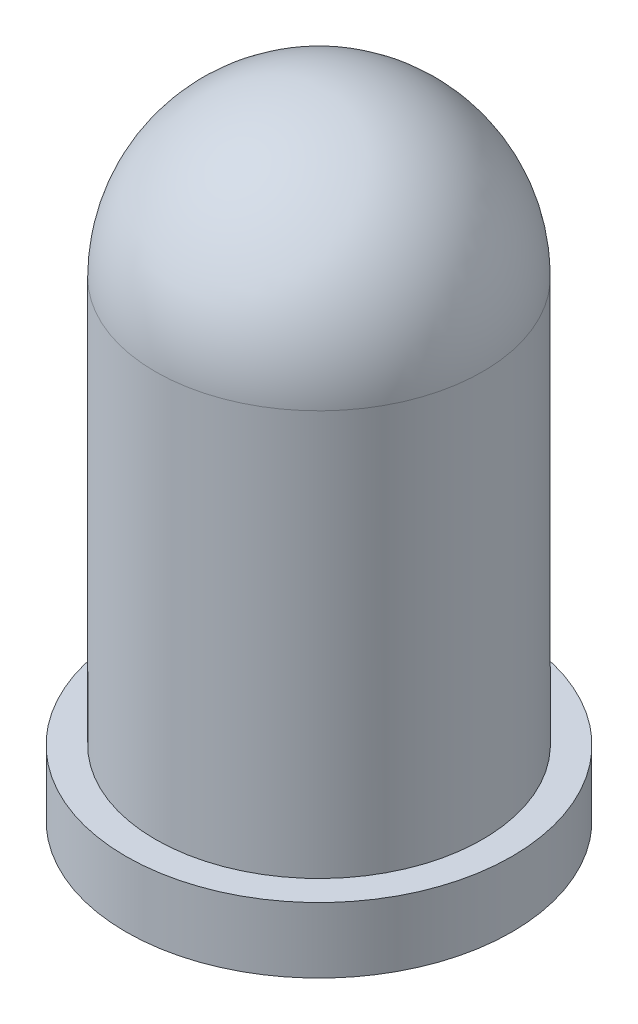
ISO-10303-21;
HEADER;
FILE_DESCRIPTION(('STEP AP214'),'2;1');
FILE_NAME('part.step','',(''),(''),'','','');
FILE_SCHEMA(('AUTOMOTIVE_DESIGN { 1 0 10303 214 1 1 1 1 }'));
ENDSEC;
DATA;
#1=APPLICATION_CONTEXT('core data for automotive mechanical design processes');
#2=APPLICATION_PROTOCOL_DEFINITION('international standard','automotive_design',2000,#1);
#3=PRODUCT_CONTEXT('',#1,'mechanical');
#4=PRODUCT('Part','Part','',(#3));
#5=PRODUCT_RELATED_PRODUCT_CATEGORY('part','',(#4));
#6=PRODUCT_DEFINITION_FORMATION('','',#4);
#7=PRODUCT_DEFINITION_CONTEXT('part definition',#1,'design');
#8=PRODUCT_DEFINITION('design','',#6,#7);
#9=PRODUCT_DEFINITION_SHAPE('','',#8);
#10=(LENGTH_UNIT() NAMED_UNIT(*) SI_UNIT(.MILLI.,.METRE.));
#11=(NAMED_UNIT(*) PLANE_ANGLE_UNIT() SI_UNIT($,.RADIAN.));
#12=(NAMED_UNIT(*) SI_UNIT($,.STERADIAN.) SOLID_ANGLE_UNIT());
#13=UNCERTAINTY_MEASURE_WITH_UNIT(LENGTH_MEASURE(1.E-05),#10,'distance_accuracy_value','');
#14=(GEOMETRIC_REPRESENTATION_CONTEXT(3) GLOBAL_UNCERTAINTY_ASSIGNED_CONTEXT((#13)) GLOBAL_UNIT_ASSIGNED_CONTEXT((#10,
#11,#12)) REPRESENTATION_CONTEXT('',''));
#15=CARTESIAN_POINT('',(0.,0.,0.));
#16=DIRECTION('',(0.,0.,1.));
#17=DIRECTION('',(1.,0.,0.));
#18=AXIS2_PLACEMENT_3D('',#15,#16,#17);
#19=CARTESIAN_POINT('',(0.,9.12450042,0.));
#20=DIRECTION('',(0.,1.,0.));
#21=DIRECTION('',(0.,0.,1.));
#22=AXIS2_PLACEMENT_3D('',#19,#20,#21);
#23=CYLINDRICAL_SURFACE('',#22,2.499995);
#24=CARTESIAN_POINT('',(0.,6.1900054,0.));
#25=DIRECTION('',(0.,1.,0.));
#26=DIRECTION('',(0.,0.,1.));
#27=AXIS2_PLACEMENT_3D('',#24,#25,#26);
#28=CIRCLE('',#27,2.499995);
#29=CARTESIAN_POINT('',(0.,6.1900054,2.499995));
#30=VERTEX_POINT('',#29);
#31=EDGE_CURVE('E10',#30,#30,#28,.T.);
#32=ORIENTED_EDGE('',*,*,#31,.F.);
#33=EDGE_LOOP('',(#32));
#34=FACE_BOUND('',#33,.T.);
#35=CARTESIAN_POINT('',(0.,0.,0.));
#36=DIRECTION('',(0.,1.,0.));
#37=DIRECTION('',(0.,0.,1.));
#38=AXIS2_PLACEMENT_3D('',#35,#36,#37);
#39=CIRCLE('',#38,2.499995);
#40=CARTESIAN_POINT('',(0.,0.,2.499995));
#41=VERTEX_POINT('',#40);
#42=EDGE_CURVE('E47',#41,#41,#39,.T.);
#43=ORIENTED_EDGE('',*,*,#42,.T.);
#44=EDGE_LOOP('',(#43));
#45=FACE_BOUND('',#44,.T.);
#46=ADVANCED_FACE('F32',(#34,#45),#23,.T.);
#47=CARTESIAN_POINT('',(0.,6.1900054,0.));
#48=DIRECTION('',(0.,1.,0.));
#49=DIRECTION('',(-1.,0.,0.));
#50=AXIS2_PLACEMENT_3D('',#47,#48,#49);
#51=SPHERICAL_SURFACE('',#50,2.499995);
#52=ORIENTED_EDGE('',*,*,#31,.T.);
#53=EDGE_LOOP('',(#52));
#54=FACE_BOUND('',#53,.T.);
#55=ADVANCED_FACE('F91',(#54),#51,.T.);
#56=CARTESIAN_POINT('',(0.,0.,0.));
#57=DIRECTION('',(0.,1.,0.));
#58=DIRECTION('',(0.,0.,1.));
#59=AXIS2_PLACEMENT_3D('',#56,#57,#58);
#60=PLANE('',#59);
#61=CARTESIAN_POINT('',(0.,0.,0.));
#62=DIRECTION('',(0.,1.,0.));
#63=DIRECTION('',(0.,0.,1.));
#64=AXIS2_PLACEMENT_3D('',#61,#62,#63);
#65=CIRCLE('',#64,2.9499941);
#66=CARTESIAN_POINT('',(0.,0.,2.9499941));
#67=VERTEX_POINT('',#66);
#68=EDGE_CURVE('E53',#67,#67,#65,.T.);
#69=ORIENTED_EDGE('',*,*,#68,.T.);
#70=EDGE_LOOP('',(#69));
#71=FACE_BOUND('',#70,.T.);
#72=ORIENTED_EDGE('',*,*,#42,.F.);
#73=EDGE_LOOP('',(#72));
#74=FACE_BOUND('',#73,.T.);
#75=ADVANCED_FACE('F80',(#71,#74),#60,.T.);
#76=CARTESIAN_POINT('',(0.,-1.00000054,0.));
#77=DIRECTION('',(0.,1.,0.));
#78=DIRECTION('',(0.,0.,1.));
#79=AXIS2_PLACEMENT_3D('',#76,#77,#78);
#80=CYLINDRICAL_SURFACE('',#79,2.9499941);
#81=CARTESIAN_POINT('',(0.,-1.00000054,0.));
#82=DIRECTION('',(0.,1.,0.));
#83=DIRECTION('',(0.,0.,1.));
#84=AXIS2_PLACEMENT_3D('',#81,#82,#83);
#85=CIRCLE('',#84,2.9499941);
#86=CARTESIAN_POINT('',(0.,-1.00000054,2.9499941));
#87=VERTEX_POINT('',#86);
#88=EDGE_CURVE('E52',#87,#87,#85,.T.);
#89=ORIENTED_EDGE('',*,*,#88,.T.);
#90=EDGE_LOOP('',(#89));
#91=FACE_BOUND('',#90,.T.);
#92=ORIENTED_EDGE('',*,*,#68,.F.);
#93=EDGE_LOOP('',(#92));
#94=FACE_BOUND('',#93,.T.);
#95=ADVANCED_FACE('F90',(#91,#94),#80,.T.);
#96=CARTESIAN_POINT('',(0.,-1.00000054,0.));
#97=DIRECTION('',(0.,1.,0.));
#98=DIRECTION('',(0.,0.,1.));
#99=AXIS2_PLACEMENT_3D('',#96,#97,#98);
#100=PLANE('',#99);
#101=ORIENTED_EDGE('',*,*,#88,.F.);
#102=EDGE_LOOP('',(#101));
#103=FACE_BOUND('',#102,.T.);
#104=ADVANCED_FACE('F97',(#103),#100,.F.);
#105=CLOSED_SHELL('',(#46,#55,#75,#95,#104));
#106=CARTESIAN_POINT('',(0.,0.,0.));
#107=DIRECTION('',(0.,1.,0.));
#108=DIRECTION('',(0.,0.,1.));
#109=AXIS2_PLACEMENT_3D('',#106,#107,#108);
#110=CIRCLE('',#109,2.245995);
#111=CARTESIAN_POINT('',(0.,0.,2.245995));
#112=VERTEX_POINT('',#111);
#113=EDGE_CURVE('E43',#112,#112,#110,.T.);
#114=ORIENTED_EDGE('',*,*,#113,.T.);
#115=EDGE_LOOP('',(#114));
#116=FACE_BOUND('',#115,.T.);
#117=CARTESIAN_POINT('',(0.,0.,0.));
#118=DIRECTION('',(0.,1.,0.));
#119=DIRECTION('',(0.,0.,1.));
#120=AXIS2_PLACEMENT_3D('',#117,#118,#119);
#121=CIRCLE('',#120,1.27);
#122=CARTESIAN_POINT('',(0.,0.,1.27));
#123=VERTEX_POINT('',#122);
#124=EDGE_CURVE('E59',#123,#123,#121,.T.);
#125=ORIENTED_EDGE('',*,*,#124,.F.);
#126=EDGE_LOOP('',(#125));
#127=FACE_BOUND('',#126,.T.);
#128=ADVANCED_FACE('F75',(#116,#127),#60,.T.);
#129=CARTESIAN_POINT('',(0.,6.1900054,0.));
#130=DIRECTION('',(0.,1.,0.));
#131=DIRECTION('',(-1.,0.,0.));
#132=AXIS2_PLACEMENT_3D('',#129,#130,#131);
#133=SPHERICAL_SURFACE('',#132,2.245995);
#134=CARTESIAN_POINT('',(0.,6.1900054,0.));
#135=DIRECTION('',(0.,1.,0.));
#136=DIRECTION('',(0.,0.,1.));
#137=AXIS2_PLACEMENT_3D('',#134,#135,#136);
#138=CIRCLE('',#137,2.245995);
#139=CARTESIAN_POINT('',(0.,6.1900054,2.245995));
#140=VERTEX_POINT('',#139);
#141=EDGE_CURVE('E39',#140,#140,#138,.T.);
#142=ORIENTED_EDGE('',*,*,#141,.F.);
#143=EDGE_LOOP('',(#142));
#144=FACE_BOUND('',#143,.T.);
#145=ADVANCED_FACE('F77',(#144),#133,.F.);
#146=CARTESIAN_POINT('',(0.,9.12450042,0.));
#147=DIRECTION('',(0.,1.,0.));
#148=DIRECTION('',(0.,0.,1.));
#149=AXIS2_PLACEMENT_3D('',#146,#147,#148);
#150=CYLINDRICAL_SURFACE('',#149,2.245995);
#151=ORIENTED_EDGE('',*,*,#141,.T.);
#152=EDGE_LOOP('',(#151));
#153=FACE_BOUND('',#152,.T.);
#154=ORIENTED_EDGE('',*,*,#113,.F.);
#155=EDGE_LOOP('',(#154));
#156=FACE_BOUND('',#155,.T.);
#157=ADVANCED_FACE('F70',(#153,#156),#150,.F.);
#158=CARTESIAN_POINT('',(0.,5.08,0.));
#159=DIRECTION('',(0.,-1.,0.));
#160=DIRECTION('',(0.,0.,-1.));
#161=AXIS2_PLACEMENT_3D('',#158,#159,#160);
#162=CYLINDRICAL_SURFACE('',#161,1.27);
#163=CARTESIAN_POINT('',(0.,5.08,0.));
#164=DIRECTION('',(0.,1.,0.));
#165=DIRECTION('',(0.,0.,1.));
#166=AXIS2_PLACEMENT_3D('',#163,#164,#165);
#167=CIRCLE('',#166,1.27);
#168=CARTESIAN_POINT('',(0.,5.08,1.27));
#169=VERTEX_POINT('',#168);
#170=EDGE_CURVE('E56',#169,#169,#167,.T.);
#171=ORIENTED_EDGE('',*,*,#170,.F.);
#172=EDGE_LOOP('',(#171));
#173=FACE_BOUND('',#172,.T.);
#174=ORIENTED_EDGE('',*,*,#124,.T.);
#175=EDGE_LOOP('',(#174));
#176=FACE_BOUND('',#175,.T.);
#177=ADVANCED_FACE('F67',(#173,#176),#162,.T.);
#178=CARTESIAN_POINT('',(0.,5.08,0.));
#179=DIRECTION('',(0.,1.,0.));
#180=DIRECTION('',(0.,0.,1.));
#181=AXIS2_PLACEMENT_3D('',#178,#179,#180);
#182=PLANE('',#181);
#183=ORIENTED_EDGE('',*,*,#170,.T.);
#184=EDGE_LOOP('',(#183));
#185=FACE_BOUND('',#184,.T.);
#186=ADVANCED_FACE('F65',(#185),#182,.T.);
#187=CLOSED_SHELL('',(#128,#145,#157,#177,#186));
#188=ORIENTED_CLOSED_SHELL('',*,#187,.T.);
#189=BREP_WITH_VOIDS('B2',#105,(#188));
#190=ADVANCED_BREP_SHAPE_REPRESENTATION('',(#18,#189),#14);
#191=SHAPE_DEFINITION_REPRESENTATION(#9,#190);
ENDSEC;
END-ISO-10303-21;
